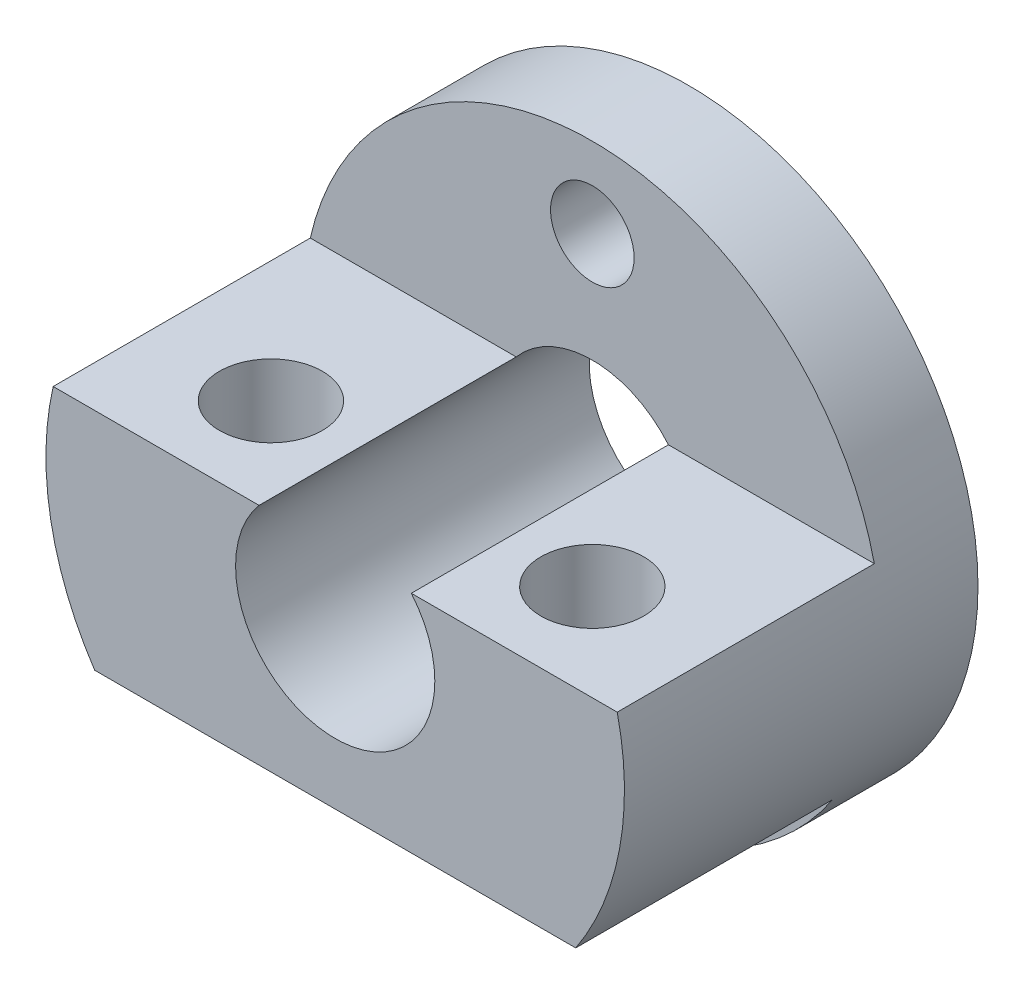
ISO-10303-21;
HEADER;
FILE_DESCRIPTION(('STEP AP214'),'2;1');
FILE_NAME('part.step','',(''),(''),'','','');
FILE_SCHEMA(('AUTOMOTIVE_DESIGN { 1 0 10303 214 1 1 1 1 }'));
ENDSEC;
DATA;
#1=APPLICATION_CONTEXT('core data for automotive mechanical design processes');
#2=APPLICATION_PROTOCOL_DEFINITION('international standard','automotive_design',2000,#1);
#3=PRODUCT_CONTEXT('',#1,'mechanical');
#4=PRODUCT('Part','Part','',(#3));
#5=PRODUCT_RELATED_PRODUCT_CATEGORY('part','',(#4));
#6=PRODUCT_DEFINITION_FORMATION('','',#4);
#7=PRODUCT_DEFINITION_CONTEXT('part definition',#1,'design');
#8=PRODUCT_DEFINITION('design','',#6,#7);
#9=PRODUCT_DEFINITION_SHAPE('','',#8);
#10=(LENGTH_UNIT() NAMED_UNIT(*) SI_UNIT(.MILLI.,.METRE.));
#11=(NAMED_UNIT(*) PLANE_ANGLE_UNIT() SI_UNIT($,.RADIAN.));
#12=(NAMED_UNIT(*) SI_UNIT($,.STERADIAN.) SOLID_ANGLE_UNIT());
#13=UNCERTAINTY_MEASURE_WITH_UNIT(LENGTH_MEASURE(1.E-05),#10,'distance_accuracy_value','');
#14=(GEOMETRIC_REPRESENTATION_CONTEXT(3) GLOBAL_UNCERTAINTY_ASSIGNED_CONTEXT((#13)) GLOBAL_UNIT_ASSIGNED_CONTEXT((#10,
#11,#12)) REPRESENTATION_CONTEXT('',''));
#15=CARTESIAN_POINT('',(0.,0.,0.));
#16=DIRECTION('',(0.,0.,1.));
#17=DIRECTION('',(1.,0.,0.));
#18=AXIS2_PLACEMENT_3D('',#15,#16,#17);
#19=CARTESIAN_POINT('',(0.,0.,3.));
#20=DIRECTION('',(0.,0.,1.));
#21=DIRECTION('',(1.,0.,0.));
#22=AXIS2_PLACEMENT_3D('',#19,#20,#21);
#23=PLANE('',#22);
#24=CARTESIAN_POINT('',(0.,6.5,3.));
#25=DIRECTION('',(0.,0.,1.));
#26=DIRECTION('',(1.,0.,0.));
#27=AXIS2_PLACEMENT_3D('',#24,#25,#26);
#28=CIRCLE('',#27,1.3);
#29=CARTESIAN_POINT('',(1.3,6.5,3.));
#30=VERTEX_POINT('',#29);
#31=EDGE_CURVE('E161',#30,#30,#28,.T.);
#32=ORIENTED_EDGE('',*,*,#31,.F.);
#33=EDGE_LOOP('',(#32));
#34=FACE_BOUND('',#33,.T.);
#35=DIRECTION('',(1.,0.,0.));
#36=VECTOR('',#35,1.);
#37=CARTESIAN_POINT('',(-8.77496438739212,2.,3.));
#38=LINE('',#37,#36);
#39=CARTESIAN_POINT('',(2.3685438564654,2.,3.));
#40=VERTEX_POINT('',#39);
#41=CARTESIAN_POINT('',(8.77496438739212,2.,3.));
#42=VERTEX_POINT('',#41);
#43=EDGE_CURVE('E108',#40,#42,#38,.T.);
#44=ORIENTED_EDGE('',*,*,#43,.T.);
#45=CARTESIAN_POINT('',(0.,0.,3.));
#46=DIRECTION('',(0.,0.,1.));
#47=DIRECTION('',(1.,0.,0.));
#48=AXIS2_PLACEMENT_3D('',#45,#46,#47);
#49=CIRCLE('',#48,9.);
#50=CARTESIAN_POINT('',(-8.77496438739212,2.,3.));
#51=VERTEX_POINT('',#50);
#52=EDGE_CURVE('E104',#42,#51,#49,.T.);
#53=ORIENTED_EDGE('',*,*,#52,.T.);
#54=CARTESIAN_POINT('',(-2.3685438564654,2.,3.));
#55=VERTEX_POINT('',#54);
#56=EDGE_CURVE('E106',#51,#55,#38,.T.);
#57=ORIENTED_EDGE('',*,*,#56,.T.);
#58=CARTESIAN_POINT('',(0.,0.,3.));
#59=DIRECTION('',(0.,0.,1.));
#60=DIRECTION('',(1.,0.,0.));
#61=AXIS2_PLACEMENT_3D('',#58,#59,#60);
#62=CIRCLE('',#61,3.1);
#63=EDGE_CURVE('E154',#40,#55,#62,.T.);
#64=ORIENTED_EDGE('',*,*,#63,.F.);
#65=EDGE_LOOP('',(#44,#53,#57,#64));
#66=FACE_BOUND('',#65,.T.);
#67=ADVANCED_FACE('F48',(#34,#66),#23,.T.);
#68=CARTESIAN_POINT('',(0.,-6.5,3.));
#69=DIRECTION('',(0.,0.,1.));
#70=DIRECTION('',(1.,0.,0.));
#71=AXIS2_PLACEMENT_3D('',#68,#69,#70);
#72=CIRCLE('',#71,1.3);
#73=CARTESIAN_POINT('',(1.3,-6.5,3.));
#74=VERTEX_POINT('',#73);
#75=EDGE_CURVE('E218',#74,#74,#72,.T.);
#76=ORIENTED_EDGE('',*,*,#75,.F.);
#77=EDGE_LOOP('',(#76));
#78=FACE_BOUND('',#77,.T.);
#79=DIRECTION('',(-1.,0.,0.));
#80=VECTOR('',#79,1.);
#81=CARTESIAN_POINT('',(-7.48331477354788,-5.,3.));
#82=LINE('',#81,#80);
#83=CARTESIAN_POINT('',(7.48331477354788,-5.,3.));
#84=VERTEX_POINT('',#83);
#85=CARTESIAN_POINT('',(-7.48331477354788,-5.,3.));
#86=VERTEX_POINT('',#85);
#87=EDGE_CURVE('E137',#84,#86,#82,.T.);
#88=ORIENTED_EDGE('',*,*,#87,.T.);
#89=EDGE_CURVE('E114',#86,#84,#49,.T.);
#90=ORIENTED_EDGE('',*,*,#89,.T.);
#91=EDGE_LOOP('',(#88,#90));
#92=FACE_BOUND('',#91,.T.);
#93=ADVANCED_FACE('F208',(#78,#92),#23,.T.);
#94=CARTESIAN_POINT('',(0.,0.,0.));
#95=DIRECTION('',(0.,0.,1.));
#96=DIRECTION('',(1.,0.,0.));
#97=AXIS2_PLACEMENT_3D('',#94,#95,#96);
#98=PLANE('',#97);
#99=CARTESIAN_POINT('',(0.,0.,0.));
#100=DIRECTION('',(0.,0.,1.));
#101=DIRECTION('',(1.,0.,0.));
#102=AXIS2_PLACEMENT_3D('',#99,#100,#101);
#103=CIRCLE('',#102,3.1);
#104=CARTESIAN_POINT('',(3.1,0.,0.));
#105=VERTEX_POINT('',#104);
#106=EDGE_CURVE('E141',#105,#105,#103,.T.);
#107=ORIENTED_EDGE('',*,*,#106,.T.);
#108=EDGE_LOOP('',(#107));
#109=FACE_BOUND('',#108,.T.);
#110=CARTESIAN_POINT('',(0.,-6.5,0.));
#111=DIRECTION('',(0.,0.,1.));
#112=DIRECTION('',(1.,0.,0.));
#113=AXIS2_PLACEMENT_3D('',#110,#111,#112);
#114=CIRCLE('',#113,1.3);
#115=CARTESIAN_POINT('',(1.3,-6.5,0.));
#116=VERTEX_POINT('',#115);
#117=EDGE_CURVE('E156',#116,#116,#114,.T.);
#118=ORIENTED_EDGE('',*,*,#117,.T.);
#119=EDGE_LOOP('',(#118));
#120=FACE_BOUND('',#119,.T.);
#121=CARTESIAN_POINT('',(0.,6.5,0.));
#122=DIRECTION('',(0.,0.,1.));
#123=DIRECTION('',(1.,0.,0.));
#124=AXIS2_PLACEMENT_3D('',#121,#122,#123);
#125=CIRCLE('',#124,1.3);
#126=CARTESIAN_POINT('',(1.3,6.5,0.));
#127=VERTEX_POINT('',#126);
#128=EDGE_CURVE('E160',#127,#127,#125,.T.);
#129=ORIENTED_EDGE('',*,*,#128,.T.);
#130=EDGE_LOOP('',(#129));
#131=FACE_BOUND('',#130,.T.);
#132=CARTESIAN_POINT('',(0.,0.,0.));
#133=DIRECTION('',(0.,0.,1.));
#134=DIRECTION('',(1.,0.,0.));
#135=AXIS2_PLACEMENT_3D('',#132,#133,#134);
#136=CIRCLE('',#135,9.);
#137=CARTESIAN_POINT('',(9.,0.,0.));
#138=VERTEX_POINT('',#137);
#139=EDGE_CURVE('E52',#138,#138,#136,.T.);
#140=ORIENTED_EDGE('',*,*,#139,.F.);
#141=EDGE_LOOP('',(#140));
#142=FACE_BOUND('',#141,.T.);
#143=ADVANCED_FACE('F50',(#109,#120,#131,#142),#98,.F.);
#144=CARTESIAN_POINT('',(-8.77496438739212,2.,3.));
#145=DIRECTION('',(0.,-1.,0.));
#146=DIRECTION('',(0.,0.,-1.));
#147=AXIS2_PLACEMENT_3D('',#144,#145,#146);
#148=PLANE('',#147);
#149=CARTESIAN_POINT('',(5.,2.,8.));
#150=DIRECTION('',(0.,1.,0.));
#151=DIRECTION('',(0.,0.,1.));
#152=AXIS2_PLACEMENT_3D('',#149,#150,#151);
#153=CIRCLE('',#152,1.6);
#154=CARTESIAN_POINT('',(5.,2.,9.6));
#155=VERTEX_POINT('',#154);
#156=EDGE_CURVE('E164',#155,#155,#153,.T.);
#157=ORIENTED_EDGE('',*,*,#156,.F.);
#158=EDGE_LOOP('',(#157));
#159=FACE_BOUND('',#158,.T.);
#160=DIRECTION('',(-1.,0.,0.));
#161=VECTOR('',#160,1.);
#162=CARTESIAN_POINT('',(-8.77496438739212,2.,11.));
#163=LINE('',#162,#161);
#164=CARTESIAN_POINT('',(8.77496438739212,2.,11.));
#165=VERTEX_POINT('',#164);
#166=CARTESIAN_POINT('',(2.3685438564654,2.,11.));
#167=VERTEX_POINT('',#166);
#168=EDGE_CURVE('E64',#165,#167,#163,.T.);
#169=ORIENTED_EDGE('',*,*,#168,.F.);
#170=DIRECTION('',(0.,0.,1.));
#171=VECTOR('',#170,1.);
#172=CARTESIAN_POINT('',(8.77496438739212,2.,3.));
#173=LINE('',#172,#171);
#174=EDGE_CURVE('E128',#42,#165,#173,.T.);
#175=ORIENTED_EDGE('',*,*,#174,.F.);
#176=ORIENTED_EDGE('',*,*,#43,.F.);
#177=DIRECTION('',(0.,0.,1.));
#178=VECTOR('',#177,1.);
#179=CARTESIAN_POINT('',(2.3685438564654,2.,-4.));
#180=LINE('',#179,#178);
#181=EDGE_CURVE('E58',#40,#167,#180,.T.);
#182=ORIENTED_EDGE('',*,*,#181,.T.);
#183=EDGE_LOOP('',(#169,#175,#176,#182));
#184=FACE_BOUND('',#183,.T.);
#185=ADVANCED_FACE('F195',(#159,#184),#148,.F.);
#186=CARTESIAN_POINT('',(0.,0.,16.));
#187=DIRECTION('',(0.,0.,-1.));
#188=DIRECTION('',(-1.,0.,0.));
#189=AXIS2_PLACEMENT_3D('',#186,#187,#188);
#190=CYLINDRICAL_SURFACE('',#189,9.);
#191=CARTESIAN_POINT('',(0.,0.,11.));
#192=DIRECTION('',(0.,0.,1.));
#193=DIRECTION('',(1.,0.,0.));
#194=AXIS2_PLACEMENT_3D('',#191,#192,#193);
#195=CIRCLE('',#194,9.);
#196=CARTESIAN_POINT('',(7.48331477354788,-5.,11.));
#197=VERTEX_POINT('',#196);
#198=EDGE_CURVE('E198',#197,#165,#195,.T.);
#199=ORIENTED_EDGE('',*,*,#198,.F.);
#200=DIRECTION('',(0.,0.,1.));
#201=VECTOR('',#200,1.);
#202=CARTESIAN_POINT('',(7.48331477354788,-5.,3.));
#203=LINE('',#202,#201);
#204=EDGE_CURVE('E133',#84,#197,#203,.T.);
#205=ORIENTED_EDGE('',*,*,#204,.F.);
#206=ORIENTED_EDGE('',*,*,#89,.F.);
#207=DIRECTION('',(0.,0.,1.));
#208=VECTOR('',#207,1.);
#209=CARTESIAN_POINT('',(-7.48331477354788,-5.,3.));
#210=LINE('',#209,#208);
#211=CARTESIAN_POINT('',(-7.48331477354788,-5.,11.));
#212=VERTEX_POINT('',#211);
#213=EDGE_CURVE('E138',#86,#212,#210,.T.);
#214=ORIENTED_EDGE('',*,*,#213,.T.);
#215=CARTESIAN_POINT('',(-8.77496438739212,2.,11.));
#216=VERTEX_POINT('',#215);
#217=EDGE_CURVE('E126',#216,#212,#195,.T.);
#218=ORIENTED_EDGE('',*,*,#217,.F.);
#219=DIRECTION('',(0.,0.,1.));
#220=VECTOR('',#219,1.);
#221=CARTESIAN_POINT('',(-8.77496438739212,2.,3.));
#222=LINE('',#221,#220);
#223=EDGE_CURVE('E118',#51,#216,#222,.T.);
#224=ORIENTED_EDGE('',*,*,#223,.F.);
#225=ORIENTED_EDGE('',*,*,#52,.F.);
#226=ORIENTED_EDGE('',*,*,#174,.T.);
#227=EDGE_LOOP('',(#199,#205,#206,#214,#218,#224,#225,#226));
#228=FACE_BOUND('',#227,.T.);
#229=ORIENTED_EDGE('',*,*,#139,.T.);
#230=EDGE_LOOP('',(#229));
#231=FACE_BOUND('',#230,.T.);
#232=ADVANCED_FACE('F123',(#228,#231),#190,.T.);
#233=CARTESIAN_POINT('',(-7.48331477354788,-5.,3.));
#234=DIRECTION('',(0.,1.,0.));
#235=DIRECTION('',(0.,0.,1.));
#236=AXIS2_PLACEMENT_3D('',#233,#234,#235);
#237=PLANE('',#236);
#238=CARTESIAN_POINT('',(5.,-5.,8.));
#239=DIRECTION('',(0.,1.,0.));
#240=DIRECTION('',(0.,0.,1.));
#241=AXIS2_PLACEMENT_3D('',#238,#239,#240);
#242=CIRCLE('',#241,1.6);
#243=CARTESIAN_POINT('',(5.,-5.,9.6));
#244=VERTEX_POINT('',#243);
#245=EDGE_CURVE('E150',#244,#244,#242,.T.);
#246=ORIENTED_EDGE('',*,*,#245,.T.);
#247=EDGE_LOOP('',(#246));
#248=FACE_BOUND('',#247,.T.);
#249=CARTESIAN_POINT('',(-5.,-5.,8.));
#250=DIRECTION('',(0.,1.,0.));
#251=DIRECTION('',(0.,0.,1.));
#252=AXIS2_PLACEMENT_3D('',#249,#250,#251);
#253=CIRCLE('',#252,1.6);
#254=CARTESIAN_POINT('',(-5.,-5.,9.6));
#255=VERTEX_POINT('',#254);
#256=EDGE_CURVE('E155',#255,#255,#253,.T.);
#257=ORIENTED_EDGE('',*,*,#256,.T.);
#258=EDGE_LOOP('',(#257));
#259=FACE_BOUND('',#258,.T.);
#260=DIRECTION('',(1.,0.,0.));
#261=VECTOR('',#260,1.);
#262=CARTESIAN_POINT('',(-7.48331477354788,-5.,11.));
#263=LINE('',#262,#261);
#264=EDGE_CURVE('E206',#212,#197,#263,.T.);
#265=ORIENTED_EDGE('',*,*,#264,.F.);
#266=ORIENTED_EDGE('',*,*,#213,.F.);
#267=ORIENTED_EDGE('',*,*,#87,.F.);
#268=ORIENTED_EDGE('',*,*,#204,.T.);
#269=EDGE_LOOP('',(#265,#266,#267,#268));
#270=FACE_BOUND('',#269,.T.);
#271=ADVANCED_FACE('F204',(#248,#259,#270),#237,.F.);
#272=CARTESIAN_POINT('',(-5.,2.,8.));
#273=DIRECTION('',(0.,1.,0.));
#274=DIRECTION('',(0.,0.,1.));
#275=AXIS2_PLACEMENT_3D('',#272,#273,#274);
#276=CIRCLE('',#275,1.6);
#277=CARTESIAN_POINT('',(-5.,2.,9.6));
#278=VERTEX_POINT('',#277);
#279=EDGE_CURVE('E169',#278,#278,#276,.T.);
#280=ORIENTED_EDGE('',*,*,#279,.F.);
#281=EDGE_LOOP('',(#280));
#282=FACE_BOUND('',#281,.T.);
#283=DIRECTION('',(-1.,0.,0.));
#284=VECTOR('',#283,1.);
#285=CARTESIAN_POINT('',(-8.77496438739212,2.,11.));
#286=LINE('',#285,#284);
#287=CARTESIAN_POINT('',(-2.3685438564654,2.,11.));
#288=VERTEX_POINT('',#287);
#289=EDGE_CURVE('E211',#288,#216,#286,.T.);
#290=ORIENTED_EDGE('',*,*,#289,.F.);
#291=DIRECTION('',(0.,0.,1.));
#292=VECTOR('',#291,1.);
#293=CARTESIAN_POINT('',(-2.3685438564654,2.,-4.));
#294=LINE('',#293,#292);
#295=EDGE_CURVE('E72',#288,#55,#294,.F.);
#296=ORIENTED_EDGE('',*,*,#295,.T.);
#297=ORIENTED_EDGE('',*,*,#56,.F.);
#298=ORIENTED_EDGE('',*,*,#223,.T.);
#299=EDGE_LOOP('',(#290,#296,#297,#298));
#300=FACE_BOUND('',#299,.T.);
#301=ADVANCED_FACE('F117',(#282,#300),#148,.F.);
#302=CARTESIAN_POINT('',(0.,0.,-4.));
#303=DIRECTION('',(0.,0.,1.));
#304=DIRECTION('',(1.,0.,0.));
#305=AXIS2_PLACEMENT_3D('',#302,#303,#304);
#306=CYLINDRICAL_SURFACE('',#305,3.1);
#307=ORIENTED_EDGE('',*,*,#106,.F.);
#308=EDGE_LOOP('',(#307));
#309=FACE_BOUND('',#308,.T.);
#310=CARTESIAN_POINT('',(0.,0.,11.));
#311=DIRECTION('',(0.,0.,1.));
#312=DIRECTION('',(1.,0.,0.));
#313=AXIS2_PLACEMENT_3D('',#310,#311,#312);
#314=CIRCLE('',#313,3.1);
#315=EDGE_CURVE('E12',#167,#288,#314,.F.);
#316=ORIENTED_EDGE('',*,*,#315,.F.);
#317=ORIENTED_EDGE('',*,*,#181,.F.);
#318=ORIENTED_EDGE('',*,*,#63,.T.);
#319=ORIENTED_EDGE('',*,*,#295,.F.);
#320=EDGE_LOOP('',(#316,#317,#318,#319));
#321=FACE_BOUND('',#320,.T.);
#322=ADVANCED_FACE('F189',(#309,#321),#306,.F.);
#323=CARTESIAN_POINT('',(-5.,-18.,8.));
#324=DIRECTION('',(0.,1.,0.));
#325=DIRECTION('',(0.,0.,1.));
#326=AXIS2_PLACEMENT_3D('',#323,#324,#325);
#327=CYLINDRICAL_SURFACE('',#326,1.6);
#328=ORIENTED_EDGE('',*,*,#279,.T.);
#329=EDGE_LOOP('',(#328));
#330=FACE_BOUND('',#329,.T.);
#331=ORIENTED_EDGE('',*,*,#256,.F.);
#332=EDGE_LOOP('',(#331));
#333=FACE_BOUND('',#332,.T.);
#334=ADVANCED_FACE('F192',(#330,#333),#327,.F.);
#335=CARTESIAN_POINT('',(5.,-18.,8.));
#336=DIRECTION('',(0.,1.,0.));
#337=DIRECTION('',(0.,0.,1.));
#338=AXIS2_PLACEMENT_3D('',#335,#336,#337);
#339=CYLINDRICAL_SURFACE('',#338,1.6);
#340=ORIENTED_EDGE('',*,*,#156,.T.);
#341=EDGE_LOOP('',(#340));
#342=FACE_BOUND('',#341,.T.);
#343=ORIENTED_EDGE('',*,*,#245,.F.);
#344=EDGE_LOOP('',(#343));
#345=FACE_BOUND('',#344,.T.);
#346=ADVANCED_FACE('F244',(#342,#345),#339,.F.);
#347=CARTESIAN_POINT('',(0.,-6.5,-17.));
#348=DIRECTION('',(0.,0.,1.));
#349=DIRECTION('',(1.,0.,0.));
#350=AXIS2_PLACEMENT_3D('',#347,#348,#349);
#351=CYLINDRICAL_SURFACE('',#350,1.3);
#352=ORIENTED_EDGE('',*,*,#75,.T.);
#353=EDGE_LOOP('',(#352));
#354=FACE_BOUND('',#353,.T.);
#355=ORIENTED_EDGE('',*,*,#117,.F.);
#356=EDGE_LOOP('',(#355));
#357=FACE_BOUND('',#356,.T.);
#358=ADVANCED_FACE('F225',(#354,#357),#351,.F.);
#359=CARTESIAN_POINT('',(0.,6.5,-17.));
#360=DIRECTION('',(0.,0.,1.));
#361=DIRECTION('',(1.,0.,0.));
#362=AXIS2_PLACEMENT_3D('',#359,#360,#361);
#363=CYLINDRICAL_SURFACE('',#362,1.3);
#364=ORIENTED_EDGE('',*,*,#31,.T.);
#365=EDGE_LOOP('',(#364));
#366=FACE_BOUND('',#365,.T.);
#367=ORIENTED_EDGE('',*,*,#128,.F.);
#368=EDGE_LOOP('',(#367));
#369=FACE_BOUND('',#368,.T.);
#370=ADVANCED_FACE('F252',(#366,#369),#363,.F.);
#371=CARTESIAN_POINT('',(0.,0.,11.));
#372=DIRECTION('',(0.,0.,1.));
#373=DIRECTION('',(1.,0.,0.));
#374=AXIS2_PLACEMENT_3D('',#371,#372,#373);
#375=PLANE('',#374);
#376=ORIENTED_EDGE('',*,*,#264,.T.);
#377=ORIENTED_EDGE('',*,*,#198,.T.);
#378=ORIENTED_EDGE('',*,*,#168,.T.);
#379=ORIENTED_EDGE('',*,*,#315,.T.);
#380=ORIENTED_EDGE('',*,*,#289,.T.);
#381=ORIENTED_EDGE('',*,*,#217,.T.);
#382=EDGE_LOOP('',(#376,#377,#378,#379,#380,#381));
#383=FACE_BOUND('',#382,.T.);
#384=ADVANCED_FACE('F255',(#383),#375,.T.);
#385=CLOSED_SHELL('',(#67,#93,#143,#185,#232,#271,#301,#322,#334,#346,#358,#370,#384));
#386=MANIFOLD_SOLID_BREP('B2',#385);
#387=ADVANCED_BREP_SHAPE_REPRESENTATION('',(#18,#386),#14);
#388=SHAPE_DEFINITION_REPRESENTATION(#9,#387);
ENDSEC;
END-ISO-10303-21;
